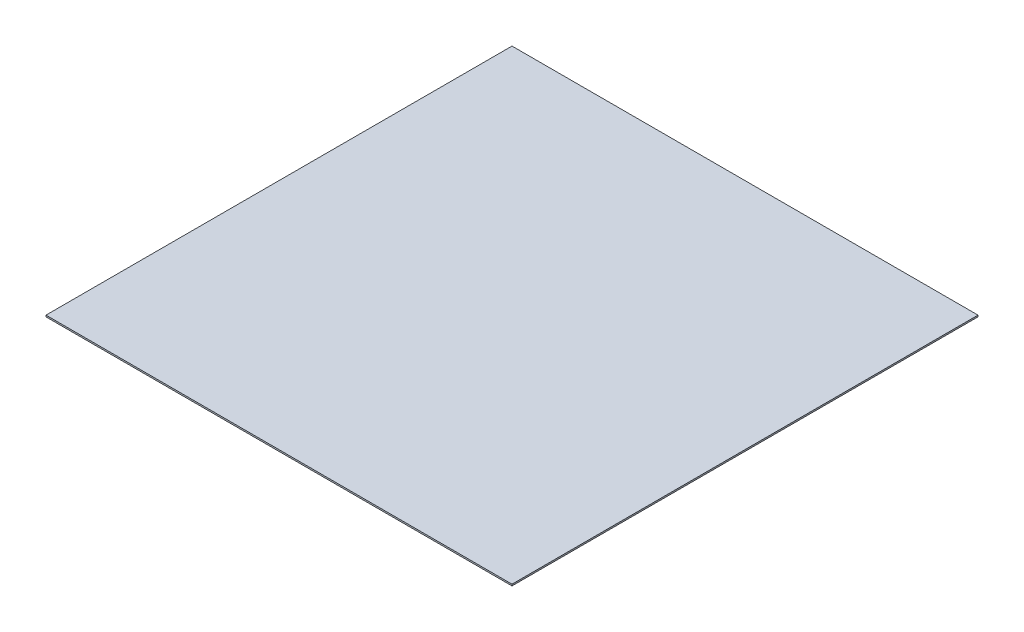
ISO-10303-21;
HEADER;
FILE_DESCRIPTION(('STEP AP214'),'2;1');
FILE_NAME('part.step','',(''),(''),'','','');
FILE_SCHEMA(('AUTOMOTIVE_DESIGN { 1 0 10303 214 1 1 1 1 }'));
ENDSEC;
DATA;
#1=APPLICATION_CONTEXT('core data for automotive mechanical design processes');
#2=APPLICATION_PROTOCOL_DEFINITION('international standard','automotive_design',2000,#1);
#3=PRODUCT_CONTEXT('',#1,'mechanical');
#4=PRODUCT('Part','Part','',(#3));
#5=PRODUCT_RELATED_PRODUCT_CATEGORY('part','',(#4));
#6=PRODUCT_DEFINITION_FORMATION('','',#4);
#7=PRODUCT_DEFINITION_CONTEXT('part definition',#1,'design');
#8=PRODUCT_DEFINITION('design','',#6,#7);
#9=PRODUCT_DEFINITION_SHAPE('','',#8);
#10=(LENGTH_UNIT() NAMED_UNIT(*) SI_UNIT(.MILLI.,.METRE.));
#11=(NAMED_UNIT(*) PLANE_ANGLE_UNIT() SI_UNIT($,.RADIAN.));
#12=(NAMED_UNIT(*) SI_UNIT($,.STERADIAN.) SOLID_ANGLE_UNIT());
#13=UNCERTAINTY_MEASURE_WITH_UNIT(LENGTH_MEASURE(1.E-05),#10,'distance_accuracy_value','');
#14=(GEOMETRIC_REPRESENTATION_CONTEXT(3) GLOBAL_UNCERTAINTY_ASSIGNED_CONTEXT((#13)) GLOBAL_UNIT_ASSIGNED_CONTEXT((#10,
#11,#12)) REPRESENTATION_CONTEXT('',''));
#15=CARTESIAN_POINT('',(0.,0.,0.));
#16=DIRECTION('',(0.,0.,1.));
#17=DIRECTION('',(1.,0.,0.));
#18=AXIS2_PLACEMENT_3D('',#15,#16,#17);
#19=CARTESIAN_POINT('',(750.,-5.,-750.));
#20=DIRECTION('',(1.,0.,0.));
#21=DIRECTION('',(0.,0.,-1.));
#22=AXIS2_PLACEMENT_3D('',#19,#20,#21);
#23=PLANE('',#22);
#24=DIRECTION('',(0.,0.,-1.));
#25=VECTOR('',#24,1.);
#26=CARTESIAN_POINT('',(750.,0.,-750.));
#27=LINE('',#26,#25);
#28=CARTESIAN_POINT('',(750.,0.,750.));
#29=VERTEX_POINT('',#28);
#30=CARTESIAN_POINT('',(750.,0.,-750.));
#31=VERTEX_POINT('',#30);
#32=EDGE_CURVE('E97',#29,#31,#27,.T.);
#33=ORIENTED_EDGE('',*,*,#32,.F.);
#34=DIRECTION('',(0.,1.,0.));
#35=VECTOR('',#34,1.);
#36=CARTESIAN_POINT('',(750.,-5.,750.));
#37=LINE('',#36,#35);
#38=CARTESIAN_POINT('',(750.,-5.,750.));
#39=VERTEX_POINT('',#38);
#40=EDGE_CURVE('E11',#39,#29,#37,.T.);
#41=ORIENTED_EDGE('',*,*,#40,.F.);
#42=DIRECTION('',(0.,0.,-1.));
#43=VECTOR('',#42,1.);
#44=CARTESIAN_POINT('',(750.,-5.,-750.));
#45=LINE('',#44,#43);
#46=CARTESIAN_POINT('',(750.,-5.,-750.));
#47=VERTEX_POINT('',#46);
#48=EDGE_CURVE('E91',#39,#47,#45,.T.);
#49=ORIENTED_EDGE('',*,*,#48,.T.);
#50=DIRECTION('',(0.,1.,0.));
#51=VECTOR('',#50,1.);
#52=CARTESIAN_POINT('',(750.,-5.,-750.));
#53=LINE('',#52,#51);
#54=EDGE_CURVE('E36',#47,#31,#53,.T.);
#55=ORIENTED_EDGE('',*,*,#54,.T.);
#56=EDGE_LOOP('',(#33,#41,#49,#55));
#57=FACE_BOUND('',#56,.T.);
#58=ADVANCED_FACE('F33',(#57),#23,.T.);
#59=CARTESIAN_POINT('',(-750.,-5.,750.));
#60=DIRECTION('',(0.,0.,1.));
#61=DIRECTION('',(1.,0.,0.));
#62=AXIS2_PLACEMENT_3D('',#59,#60,#61);
#63=PLANE('',#62);
#64=DIRECTION('',(1.,0.,0.));
#65=VECTOR('',#64,1.);
#66=CARTESIAN_POINT('',(-750.,0.,750.));
#67=LINE('',#66,#65);
#68=CARTESIAN_POINT('',(-750.,0.,750.));
#69=VERTEX_POINT('',#68);
#70=EDGE_CURVE('E93',#69,#29,#67,.T.);
#71=ORIENTED_EDGE('',*,*,#70,.F.);
#72=DIRECTION('',(0.,1.,0.));
#73=VECTOR('',#72,1.);
#74=CARTESIAN_POINT('',(-750.,-5.,750.));
#75=LINE('',#74,#73);
#76=CARTESIAN_POINT('',(-750.,-5.,750.));
#77=VERTEX_POINT('',#76);
#78=EDGE_CURVE('E42',#77,#69,#75,.T.);
#79=ORIENTED_EDGE('',*,*,#78,.F.);
#80=DIRECTION('',(1.,0.,0.));
#81=VECTOR('',#80,1.);
#82=CARTESIAN_POINT('',(-750.,-5.,750.));
#83=LINE('',#82,#81);
#84=EDGE_CURVE('E88',#77,#39,#83,.T.);
#85=ORIENTED_EDGE('',*,*,#84,.T.);
#86=ORIENTED_EDGE('',*,*,#40,.T.);
#87=EDGE_LOOP('',(#71,#79,#85,#86));
#88=FACE_BOUND('',#87,.T.);
#89=ADVANCED_FACE('F107',(#88),#63,.T.);
#90=CARTESIAN_POINT('',(-750.,-5.,-750.));
#91=DIRECTION('',(-1.,0.,0.));
#92=DIRECTION('',(0.,0.,1.));
#93=AXIS2_PLACEMENT_3D('',#90,#91,#92);
#94=PLANE('',#93);
#95=DIRECTION('',(0.,0.,1.));
#96=VECTOR('',#95,1.);
#97=CARTESIAN_POINT('',(-750.,0.,-750.));
#98=LINE('',#97,#96);
#99=CARTESIAN_POINT('',(-750.,0.,-750.));
#100=VERTEX_POINT('',#99);
#101=EDGE_CURVE('E83',#100,#69,#98,.T.);
#102=ORIENTED_EDGE('',*,*,#101,.F.);
#103=DIRECTION('',(0.,1.,0.));
#104=VECTOR('',#103,1.);
#105=CARTESIAN_POINT('',(-750.,-5.,-750.));
#106=LINE('',#105,#104);
#107=CARTESIAN_POINT('',(-750.,-5.,-750.));
#108=VERTEX_POINT('',#107);
#109=EDGE_CURVE('E78',#108,#100,#106,.T.);
#110=ORIENTED_EDGE('',*,*,#109,.F.);
#111=DIRECTION('',(0.,0.,1.));
#112=VECTOR('',#111,1.);
#113=CARTESIAN_POINT('',(-750.,-5.,-750.));
#114=LINE('',#113,#112);
#115=EDGE_CURVE('E81',#108,#77,#114,.T.);
#116=ORIENTED_EDGE('',*,*,#115,.T.);
#117=ORIENTED_EDGE('',*,*,#78,.T.);
#118=EDGE_LOOP('',(#102,#110,#116,#117));
#119=FACE_BOUND('',#118,.T.);
#120=ADVANCED_FACE('F80',(#119),#94,.T.);
#121=CARTESIAN_POINT('',(-750.,-5.,-750.));
#122=DIRECTION('',(0.,0.,-1.));
#123=DIRECTION('',(-1.,0.,0.));
#124=AXIS2_PLACEMENT_3D('',#121,#122,#123);
#125=PLANE('',#124);
#126=DIRECTION('',(-1.,0.,0.));
#127=VECTOR('',#126,1.);
#128=CARTESIAN_POINT('',(-750.,0.,-750.));
#129=LINE('',#128,#127);
#130=EDGE_CURVE('E100',#31,#100,#129,.T.);
#131=ORIENTED_EDGE('',*,*,#130,.F.);
#132=ORIENTED_EDGE('',*,*,#54,.F.);
#133=DIRECTION('',(-1.,0.,0.));
#134=VECTOR('',#133,1.);
#135=CARTESIAN_POINT('',(-750.,-5.,-750.));
#136=LINE('',#135,#134);
#137=EDGE_CURVE('E87',#47,#108,#136,.T.);
#138=ORIENTED_EDGE('',*,*,#137,.T.);
#139=ORIENTED_EDGE('',*,*,#109,.T.);
#140=EDGE_LOOP('',(#131,#132,#138,#139));
#141=FACE_BOUND('',#140,.T.);
#142=ADVANCED_FACE('F90',(#141),#125,.T.);
#143=CARTESIAN_POINT('',(0.,-5.,0.));
#144=DIRECTION('',(0.,1.,0.));
#145=DIRECTION('',(0.,0.,1.));
#146=AXIS2_PLACEMENT_3D('',#143,#144,#145);
#147=PLANE('',#146);
#148=ORIENTED_EDGE('',*,*,#48,.F.);
#149=ORIENTED_EDGE('',*,*,#84,.F.);
#150=ORIENTED_EDGE('',*,*,#115,.F.);
#151=ORIENTED_EDGE('',*,*,#137,.F.);
#152=EDGE_LOOP('',(#148,#149,#150,#151));
#153=FACE_BOUND('',#152,.T.);
#154=ADVANCED_FACE('F86',(#153),#147,.F.);
#155=CARTESIAN_POINT('',(0.,0.,0.));
#156=DIRECTION('',(0.,1.,0.));
#157=DIRECTION('',(0.,0.,1.));
#158=AXIS2_PLACEMENT_3D('',#155,#156,#157);
#159=PLANE('',#158);
#160=ORIENTED_EDGE('',*,*,#32,.T.);
#161=ORIENTED_EDGE('',*,*,#130,.T.);
#162=ORIENTED_EDGE('',*,*,#101,.T.);
#163=ORIENTED_EDGE('',*,*,#70,.T.);
#164=EDGE_LOOP('',(#160,#161,#162,#163));
#165=FACE_BOUND('',#164,.T.);
#166=ADVANCED_FACE('F106',(#165),#159,.T.);
#167=CLOSED_SHELL('',(#58,#89,#120,#142,#154,#166));
#168=MANIFOLD_SOLID_BREP('B2',#167);
#169=ADVANCED_BREP_SHAPE_REPRESENTATION('',(#18,#168),#14);
#170=SHAPE_DEFINITION_REPRESENTATION(#9,#169);
ENDSEC;
END-ISO-10303-21;
